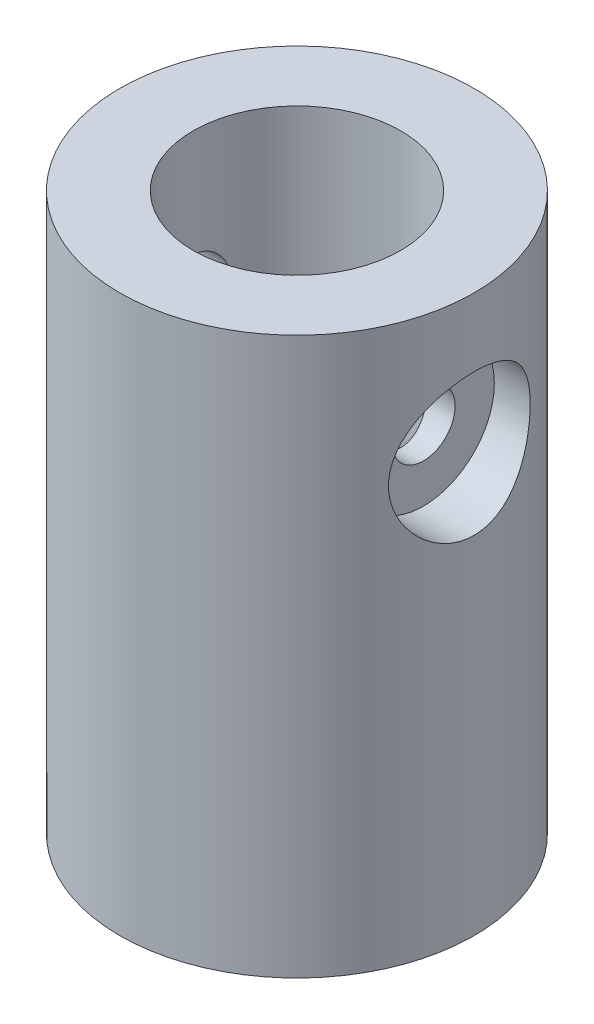
ISO-10303-21;
HEADER;
FILE_DESCRIPTION(('STEP AP214'),'2;1');
FILE_NAME('part.step','',(''),(''),'','','');
FILE_SCHEMA(('AUTOMOTIVE_DESIGN { 1 0 10303 214 1 1 1 1 }'));
ENDSEC;
DATA;
#1=APPLICATION_CONTEXT('core data for automotive mechanical design processes');
#2=APPLICATION_PROTOCOL_DEFINITION('international standard','automotive_design',2000,#1);
#3=PRODUCT_CONTEXT('',#1,'mechanical');
#4=PRODUCT('Part','Part','',(#3));
#5=PRODUCT_RELATED_PRODUCT_CATEGORY('part','',(#4));
#6=PRODUCT_DEFINITION_FORMATION('','',#4);
#7=PRODUCT_DEFINITION_CONTEXT('part definition',#1,'design');
#8=PRODUCT_DEFINITION('design','',#6,#7);
#9=PRODUCT_DEFINITION_SHAPE('','',#8);
#10=(LENGTH_UNIT() NAMED_UNIT(*) SI_UNIT(.MILLI.,.METRE.));
#11=(NAMED_UNIT(*) PLANE_ANGLE_UNIT() SI_UNIT($,.RADIAN.));
#12=(NAMED_UNIT(*) SI_UNIT($,.STERADIAN.) SOLID_ANGLE_UNIT());
#13=UNCERTAINTY_MEASURE_WITH_UNIT(LENGTH_MEASURE(1.E-05),#10,'distance_accuracy_value','');
#14=(GEOMETRIC_REPRESENTATION_CONTEXT(3) GLOBAL_UNCERTAINTY_ASSIGNED_CONTEXT((#13)) GLOBAL_UNIT_ASSIGNED_CONTEXT((#10,
#11,#12)) REPRESENTATION_CONTEXT('',''));
#15=CARTESIAN_POINT('',(0.,0.,0.));
#16=DIRECTION('',(0.,0.,1.));
#17=DIRECTION('',(1.,0.,0.));
#18=AXIS2_PLACEMENT_3D('',#15,#16,#17);
#19=CARTESIAN_POINT('',(0.,8.,0.));
#20=DIRECTION('',(0.,1.,0.));
#21=DIRECTION('',(0.,0.,1.));
#22=AXIS2_PLACEMENT_3D('',#19,#20,#21);
#23=PLANE('',#22);
#24=CARTESIAN_POINT('',(0.,8.,0.));
#25=DIRECTION('',(0.,1.,0.));
#26=DIRECTION('',(0.,0.,1.));
#27=AXIS2_PLACEMENT_3D('',#24,#25,#26);
#28=CIRCLE('',#27,4.1);
#29=CARTESIAN_POINT('',(0.,8.,4.1));
#30=VERTEX_POINT('',#29);
#31=EDGE_CURVE('E140',#30,#30,#28,.T.);
#32=ORIENTED_EDGE('',*,*,#31,.T.);
#33=EDGE_LOOP('',(#32));
#34=FACE_BOUND('',#33,.T.);
#35=DIRECTION('',(0.,0.,-1.));
#36=VECTOR('',#35,1.);
#37=CARTESIAN_POINT('',(1.95,8.,2.00935312974101));
#38=LINE('',#37,#36);
#39=CARTESIAN_POINT('',(1.95,8.,2.00935312974101));
#40=VERTEX_POINT('',#39);
#41=CARTESIAN_POINT('',(1.95,8.,-2.00935312974101));
#42=VERTEX_POINT('',#41);
#43=EDGE_CURVE('E96',#40,#42,#38,.T.);
#44=ORIENTED_EDGE('',*,*,#43,.F.);
#45=CARTESIAN_POINT('',(0.,8.,0.));
#46=DIRECTION('',(0.,-1.,0.));
#47=DIRECTION('',(0.,0.,-1.));
#48=AXIS2_PLACEMENT_3D('',#45,#46,#47);
#49=CIRCLE('',#48,2.8);
#50=CARTESIAN_POINT('',(-1.95,8.,2.00935312974101));
#51=VERTEX_POINT('',#50);
#52=EDGE_CURVE('E89',#40,#51,#49,.T.);
#53=ORIENTED_EDGE('',*,*,#52,.T.);
#54=DIRECTION('',(0.,0.,-1.));
#55=VECTOR('',#54,1.);
#56=CARTESIAN_POINT('',(-1.95,8.,2.00935312974101));
#57=LINE('',#56,#55);
#58=CARTESIAN_POINT('',(-1.95,8.,-2.00935312974101));
#59=VERTEX_POINT('',#58);
#60=EDGE_CURVE('E99',#51,#59,#57,.T.);
#61=ORIENTED_EDGE('',*,*,#60,.T.);
#62=CARTESIAN_POINT('',(0.,8.,0.));
#63=DIRECTION('',(0.,-1.,0.));
#64=DIRECTION('',(0.,0.,-1.));
#65=AXIS2_PLACEMENT_3D('',#62,#63,#64);
#66=CIRCLE('',#65,2.8);
#67=EDGE_CURVE('E60',#59,#42,#66,.T.);
#68=ORIENTED_EDGE('',*,*,#67,.T.);
#69=EDGE_LOOP('',(#44,#53,#61,#68));
#70=FACE_BOUND('',#69,.T.);
#71=ADVANCED_FACE('F39',(#34,#70),#23,.T.);
#72=CARTESIAN_POINT('',(0.,22.,0.));
#73=DIRECTION('',(0.,-1.,0.));
#74=DIRECTION('',(0.,0.,-1.));
#75=AXIS2_PLACEMENT_3D('',#72,#73,#74);
#76=CYLINDRICAL_SURFACE('',#75,7.);
#77=CARTESIAN_POINT('',(6.41560597293818,16.5,-2.79999999999999));
#78=CARTESIAN_POINT('',(6.41561231891632,16.3500268344019,-2.79999356095231));
#79=CARTESIAN_POINT('',(6.42093807315972,16.1998031879354,-2.78787842974769));
#80=CARTESIAN_POINT('',(6.4415551662924,15.9036852822606,-2.73989395224752));
#81=CARTESIAN_POINT('',(6.45687196879686,15.7578030839261,-2.70396390645276));
#82=CARTESIAN_POINT('',(6.49544575006911,15.4751274674408,-2.60992976266701));
#83=CARTESIAN_POINT('',(6.51867277965235,15.3383020593923,-2.55190920597971));
#84=CARTESIAN_POINT('',(6.57040548064423,15.0763605031928,-2.41558818471813));
#85=CARTESIAN_POINT('',(6.59890999908856,14.9512418064663,-2.33729214820789));
#86=CARTESIAN_POINT('',(6.6598120618727,14.7090355596379,-2.15785081992555));
#87=CARTESIAN_POINT('',(6.69233483831648,14.5927010408439,-2.05573111571171));
#88=CARTESIAN_POINT('',(6.75657441081389,14.3782593708019,-1.83359273318501));
#89=CARTESIAN_POINT('',(6.78829092188466,14.2801585892064,-1.71356782628285));
#90=CARTESIAN_POINT('',(6.84884770697953,14.1012310535664,-1.45320883872224));
#91=CARTESIAN_POINT('',(6.87752525057598,14.0212379804397,-1.31226055298673));
#92=CARTESIAN_POINT('',(6.92725498783522,13.8864190017567,-1.01755545089609));
#93=CARTESIAN_POINT('',(6.94831028364549,13.8315828552516,-0.863803876707634));
#94=CARTESIAN_POINT('',(6.97953654986852,13.7513219196097,-0.555752997855653));
#95=CARTESIAN_POINT('',(6.99018511478879,13.7246017604417,-0.401840578801641));
#96=CARTESIAN_POINT('',(7.00112434962403,13.697160119906,-0.0913728600175459));
#97=CARTESIAN_POINT('',(7.00141888278779,13.6964289416479,0.0651814321751764));
#98=CARTESIAN_POINT('',(6.99190747948857,13.7202758777259,0.367125492582925));
#99=CARTESIAN_POINT('',(6.98266795480079,13.7434346818566,0.51264843401864));
#100=CARTESIAN_POINT('',(6.95589008056798,13.8119900268242,0.797542352910679));
#101=CARTESIAN_POINT('',(6.93835112209878,13.8573881993579,0.936912878147734));
#102=CARTESIAN_POINT('',(6.89635554240454,13.9696910760296,1.20805711391478));
#103=CARTESIAN_POINT('',(6.87179864652713,14.0369096007415,1.33968467273045));
#104=CARTESIAN_POINT('',(6.81820419252385,14.1906510096868,1.59013141103784));
#105=CARTESIAN_POINT('',(6.78916509974009,14.2771805103402,1.70894617980514));
#106=CARTESIAN_POINT('',(6.72730292046572,14.4737087903214,1.93867635918624));
#107=CARTESIAN_POINT('',(6.69435657116462,14.5848754496019,2.04856098337284));
#108=CARTESIAN_POINT('',(6.62986325362568,14.8241868005648,2.24855038154971));
#109=CARTESIAN_POINT('',(6.59831674611307,14.9523370274738,2.33864868130177));
#110=CARTESIAN_POINT('',(6.53935656372632,15.2265866313235,2.49886586420698));
#111=CARTESIAN_POINT('',(6.51208479680791,15.3730907624741,2.56834851229076));
#112=CARTESIAN_POINT('',(6.46642626481718,15.6771016864371,2.68124676381304));
#113=CARTESIAN_POINT('',(6.44803373047835,15.8346012586172,2.72467929772917));
#114=CARTESIAN_POINT('',(6.42361663583803,16.1458500884544,2.78173692839685));
#115=CARTESIAN_POINT('',(6.41690513038593,16.29924062598,2.79702093554036));
#116=CARTESIAN_POINT('',(6.41465297016654,16.6065080908634,2.80218585702004));
#117=CARTESIAN_POINT('',(6.41910892784507,16.7603848565859,2.79207447482779));
#118=CARTESIAN_POINT('',(6.43798462102759,17.0550425089397,2.74824605270604));
#119=CARTESIAN_POINT('',(6.45182240917622,17.1960701123601,2.7159062868334));
#120=CARTESIAN_POINT('',(6.48718071438276,17.4706037666996,2.63032586167522));
#121=CARTESIAN_POINT('',(6.50870293484037,17.60410814235,2.57708056802318));
#122=CARTESIAN_POINT('',(6.55807294604142,17.8658433009139,2.4487898952742));
#123=CARTESIAN_POINT('',(6.58614186494848,17.9936406641724,2.3729480155705));
#124=CARTESIAN_POINT('',(6.64510539220913,18.2352761824182,2.20243131421855));
#125=CARTESIAN_POINT('',(6.67600114854463,18.3491086219136,2.10774882287465));
#126=CARTESIAN_POINT('',(6.73989282359983,18.5683227720391,1.89398189635281));
#127=CARTESIAN_POINT('',(6.77287530199327,18.6724591914082,1.77361160122361));
#128=CARTESIAN_POINT('',(6.83507712394545,18.8592479072537,1.51631708671591));
#129=CARTESIAN_POINT('',(6.8642963143039,18.9418993292332,1.37939219385325));
#130=CARTESIAN_POINT('',(6.91577202260546,19.0830666770487,1.09239190760422));
#131=CARTESIAN_POINT('',(6.93803020736924,19.1415883818431,0.942319673398243));
#132=CARTESIAN_POINT('',(6.97301798856466,19.2321683933597,0.633351027280367));
#133=CARTESIAN_POINT('',(6.98575275588545,19.264241061975,0.474459454387547));
#134=CARTESIAN_POINT('',(6.99970611496602,19.299306582314,0.163543114507662));
#135=CARTESIAN_POINT('',(7.00162185449643,19.3040601799868,0.0117466897129226));
#136=CARTESIAN_POINT('',(6.9956045932321,19.2890023288631,-0.290407370109171));
#137=CARTESIAN_POINT('',(6.98767308328284,19.2691945985822,-0.44076521946014));
#138=CARTESIAN_POINT('',(6.9632011873457,19.2068344968002,-0.731039262426754));
#139=CARTESIAN_POINT('',(6.94693272978597,19.1649994773408,-0.871134325410813));
#140=CARTESIAN_POINT('',(6.90752926874301,19.0605260717665,-1.14229129775964));
#141=CARTESIAN_POINT('',(6.88439299888003,18.9978838486853,-1.27335153566477));
#142=CARTESIAN_POINT('',(6.83225332456614,18.8504555293055,-1.52908425432721));
#143=CARTESIAN_POINT('',(6.8030358296208,18.7648132145448,-1.65321852526233));
#144=CARTESIAN_POINT('',(6.74225163117912,18.5750960457542,-1.8858756562071));
#145=CARTESIAN_POINT('',(6.71068395849954,18.4710135625485,-1.99439202087628));
#146=CARTESIAN_POINT('',(6.64632874314752,18.2397587944119,-2.19968170652229));
#147=CARTESIAN_POINT('',(6.61358666119334,18.1115559947983,-2.29531219403885));
#148=CARTESIAN_POINT('',(6.55269519591049,17.8398805899908,-2.46378667868409));
#149=CARTESIAN_POINT('',(6.52454635273628,17.696406192165,-2.53662799678074));
#150=CARTESIAN_POINT('',(6.47862479934689,17.4113493389417,-2.65158667832287));
#151=CARTESIAN_POINT('',(6.46014735352581,17.2707537562026,-2.69587549931374));
#152=CARTESIAN_POINT('',(6.43224156447768,16.9837153419103,-2.76180787299884));
#153=CARTESIAN_POINT('',(6.4227880120661,16.8372899972059,-2.7835145266825));
#154=CARTESIAN_POINT('',(6.41748469518927,16.6585104652439,-2.79569083059717));
#155=CARTESIAN_POINT('',(6.41678143564198,16.626837927501,-2.79730543052653));
#156=CARTESIAN_POINT('',(6.41584138611812,16.5634473324839,-2.7994607357395));
#157=CARTESIAN_POINT('',(6.41560463034288,16.5317292720428,-2.80000136228567));
#158=CARTESIAN_POINT('',(6.41560597293818,16.5,-2.79999999999999));
#159=B_SPLINE_CURVE_WITH_KNOTS('',3,(#77,#78,#79,#80,#81,#82,#83,#84,#85,#86,#87,#88,#89,#90,
#91,#92,#93,#94,#95,#96,#97,#98,#99,#100,#101,#102,#103,#104,#105,#106,#107,#108,#109,#110,#111,
#112,#113,#114,#115,#116,#117,#118,#119,#120,#121,#122,#123,#124,#125,#126,#127,#128,#129,#130,
#131,#132,#133,#134,#135,#136,#137,#138,#139,#140,#141,#142,#143,#144,#145,#146,#147,#148,#149,
#150,#151,#152,#153,#154,#155,#156,#157,#158),.UNSPECIFIED.,.T.,.F.,(4,2,2,2,2,2,2,2,2,2,2,2,2,
2,2,2,2,2,2,2,2,2,2,2,2,2,2,2,2,2,2,2,2,2,2,2,2,2,2,2,4),(0.,0.449788708274711,
0.900728270151142,1.34997915261074,1.79913200353406,2.27157865598194,2.74419004087679,
3.23543736727999,3.72648453757272,4.19375856042056,4.6608582342794,5.10172102762422,
5.54261617180682,5.99015620328856,6.43784980916042,6.91493661713896,7.39217929977976,
7.88290242204159,8.3733062672014,8.83375006534187,9.29405420871113,9.72814147319201,
10.1623250211229,10.6141161651378,11.0660916033619,11.5514522794577,12.0368327079384,
12.5220968223793,13.0070972633579,13.4604545565833,13.9137432211764,14.3531079222069,
14.7925536896002,15.2514187159589,15.7104740318989,16.1979475459986,16.6854783446286,
17.129233251467,17.5717448230694,17.6668979929343,17.7620581386157),.UNSPECIFIED.);
#160=CARTESIAN_POINT('',(6.41560597293818,16.5,-2.79999999999999));
#161=VERTEX_POINT('',#160);
#162=EDGE_CURVE('E11',#161,#161,#159,.T.);
#163=ORIENTED_EDGE('',*,*,#162,.T.);
#164=EDGE_LOOP('',(#163));
#165=FACE_BOUND('',#164,.T.);
#166=CARTESIAN_POINT('',(-7.,15.25,0.));
#167=CARTESIAN_POINT('',(-6.99999876397597,15.2500027213011,-0.0696197924423471));
#168=CARTESIAN_POINT('',(-6.99895060928587,15.2558359512252,-0.139275699399385));
#169=CARTESIAN_POINT('',(-6.99487029587919,15.2790020831912,-0.276628730775726));
#170=CARTESIAN_POINT('',(-6.99183639636521,15.2963450754189,-0.344324082054934));
#171=CARTESIAN_POINT('',(-6.98412437753366,15.341986116619,-0.475749358001673));
#172=CARTESIAN_POINT('',(-6.97944768188137,15.3702746821842,-0.539482660117311));
#173=CARTESIAN_POINT('',(-6.96896231649392,15.4369778441085,-0.661291471994225));
#174=CARTESIAN_POINT('',(-6.96315375502504,15.4753914720997,-0.719367522091878));
#175=CARTESIAN_POINT('',(-6.95097616233974,15.5616996065088,-0.828853721624178));
#176=CARTESIAN_POINT('',(-6.94460221026335,15.6096830649355,-0.880193210153491));
#177=CARTESIAN_POINT('',(-6.93204924305886,15.7135773747688,-0.974138056636682));
#178=CARTESIAN_POINT('',(-6.92587024118302,15.7694887636844,-1.01674282190199));
#179=CARTESIAN_POINT('',(-6.91435905121301,15.8881450585567,-1.09229802264274));
#180=CARTESIAN_POINT('',(-6.90903321476433,15.950935843462,-1.1251774596852));
#181=CARTESIAN_POINT('',(-6.89990026216799,16.0812605793323,-1.17989439084462));
#182=CARTESIAN_POINT('',(-6.89609302772464,16.1487941603619,-1.20173274507262));
#183=CARTESIAN_POINT('',(-6.89047765557561,16.2859344107074,-1.23352263528583));
#184=CARTESIAN_POINT('',(-6.88864889795947,16.3555117775708,-1.24359686781956));
#185=CARTESIAN_POINT('',(-6.88713528511934,16.4953914610037,-1.25195320297837));
#186=CARTESIAN_POINT('',(-6.88745025566986,16.5656937181961,-1.25023626389775));
#187=CARTESIAN_POINT('',(-6.89016971388499,16.7041444487183,-1.23515868236774));
#188=CARTESIAN_POINT('',(-6.8925492980011,16.7723085951271,-1.22193680797516));
#189=CARTESIAN_POINT('',(-6.89909080824473,16.9054353182493,-1.18444287693055));
#190=CARTESIAN_POINT('',(-6.90325280368823,16.9703977703427,-1.16017039053015));
#191=CARTESIAN_POINT('',(-6.9129166031172,17.0956872394346,-1.1011263389819));
#192=CARTESIAN_POINT('',(-6.91842561521352,17.1559869408044,-1.0662980393802));
#193=CARTESIAN_POINT('',(-6.93015785316704,17.2699387511077,-0.987171201031503));
#194=CARTESIAN_POINT('',(-6.93638114494264,17.3235902455496,-0.942871787902346));
#195=CARTESIAN_POINT('',(-6.94894965501386,17.4235251088937,-0.845308544532937));
#196=CARTESIAN_POINT('',(-6.95529534624387,17.4696924589898,-0.791925855758308));
#197=CARTESIAN_POINT('',(-6.96731186800251,17.552433066454,-0.678111000701381));
#198=CARTESIAN_POINT('',(-6.97298269290384,17.5890062438252,-0.617678775645578));
#199=CARTESIAN_POINT('',(-6.98302041929516,17.6515345118481,-0.491364562705143));
#200=CARTESIAN_POINT('',(-6.98738593655032,17.6774783411489,-0.425476883346249));
#201=CARTESIAN_POINT('',(-6.99431030998523,17.717898441096,-0.290183700517968));
#202=CARTESIAN_POINT('',(-6.99686933998133,17.7323758150364,-0.220778536182409));
#203=CARTESIAN_POINT('',(-6.9998687531765,17.7492924230225,-0.0814194926908551));
#204=CARTESIAN_POINT('',(-7.00033713461244,17.751890754274,-0.0114855085287159));
#205=CARTESIAN_POINT('',(-6.99917952689596,17.7454011301183,0.127817981130509));
#206=CARTESIAN_POINT('',(-6.99755363071634,17.7363136934861,0.197187511548229));
#207=CARTESIAN_POINT('',(-6.99240754172808,17.7068428007548,0.332894154940018));
#208=CARTESIAN_POINT('',(-6.98890072530254,17.6865390803911,0.399249135096586));
#209=CARTESIAN_POINT('',(-6.98038436613849,17.6352976849073,0.52761333334735));
#210=CARTESIAN_POINT('',(-6.97537472895227,17.6043593414156,0.589622278004152));
#211=CARTESIAN_POINT('',(-6.96433866934137,17.5323693885438,0.708218549757097));
#212=CARTESIAN_POINT('',(-6.95830256688857,17.4912196042301,0.764745364265277));
#213=CARTESIAN_POINT('',(-6.94590984015708,17.4001086744692,0.870148314945128));
#214=CARTESIAN_POINT('',(-6.93955318894436,17.3501467877033,0.919023806795196));
#215=CARTESIAN_POINT('',(-6.92714394562996,17.2421125153762,1.00833474628658));
#216=CARTESIAN_POINT('',(-6.92109590760897,17.1839501495664,1.04866208560834));
#217=CARTESIAN_POINT('',(-6.91007733322136,17.0615831552756,1.11897413538699));
#218=CARTESIAN_POINT('',(-6.90510675924693,16.9973787377986,1.14895920685206));
#219=CARTESIAN_POINT('',(-6.89684095181923,16.8650369125797,1.19757853098714));
#220=CARTESIAN_POINT('',(-6.89353813880083,16.7969188945909,1.21626421462317));
#221=CARTESIAN_POINT('',(-6.88896372120458,16.6584463524269,1.24191447945726));
#222=CARTESIAN_POINT('',(-6.88769191101738,16.5880920553776,1.24888024712932));
#223=CARTESIAN_POINT('',(-6.88733324217078,16.4482253955493,1.25085614890263));
#224=CARTESIAN_POINT('',(-6.88821524963872,16.3787154614291,1.24603664017667));
#225=CARTESIAN_POINT('',(-6.89199615523606,16.241513090991,1.22494973121549));
#226=CARTESIAN_POINT('',(-6.89489504388228,16.173820646129,1.20868238480685));
#227=CARTESIAN_POINT('',(-6.90237052940211,16.0422550619833,1.16523056932674));
#228=CARTESIAN_POINT('',(-6.9069445462846,15.978376224107,1.13806288257357));
#229=CARTESIAN_POINT('',(-6.91725701322019,15.8560557802816,1.07359967028368));
#230=CARTESIAN_POINT('',(-6.92299553483587,15.7976145088108,1.03630352227252));
#231=CARTESIAN_POINT('',(-6.93508798882304,15.686971476305,0.952042837143912));
#232=CARTESIAN_POINT('',(-6.94144922951403,15.6348653841284,0.904953705777511));
#233=CARTESIAN_POINT('',(-6.95401412176594,15.5392370970169,0.802704998630157));
#234=CARTESIAN_POINT('',(-6.9602177367425,15.4957168792614,0.747543569019636));
#235=CARTESIAN_POINT('',(-6.9718267339403,15.4181711161056,0.630185373301316));
#236=CARTESIAN_POINT('',(-6.97722528421424,15.3842248703042,0.567935518835289));
#237=CARTESIAN_POINT('',(-6.98654935562556,15.3273253983536,0.438542420095239));
#238=CARTESIAN_POINT('',(-6.99047629672906,15.3043615692512,0.371403967978271));
#239=CARTESIAN_POINT('',(-6.99558898678742,15.274884693302,0.253365877745874));
#240=CARTESIAN_POINT('',(-6.99723399859316,15.2655684315316,0.203167433835835));
#241=CARTESIAN_POINT('',(-6.99943994626216,15.2531251547981,0.101985776019469));
#242=CARTESIAN_POINT('',(-7.00000090549557,15.2499980064093,0.0510025790548298));
#243=CARTESIAN_POINT('',(-7.,15.25,0.));
#244=B_SPLINE_CURVE_WITH_KNOTS('',3,(#166,#167,#168,#169,#170,#171,#172,#173,#174,#175,#176,
#177,#178,#179,#180,#181,#182,#183,#184,#185,#186,#187,#188,#189,#190,#191,#192,#193,#194,#195,
#196,#197,#198,#199,#200,#201,#202,#203,#204,#205,#206,#207,#208,#209,#210,#211,#212,#213,#214,
#215,#216,#217,#218,#219,#220,#221,#222,#223,#224,#225,#226,#227,#228,#229,#230,#231,#232,#233,
#234,#235,#236,#237,#238,#239,#240,#241,#242,#243),.UNSPECIFIED.,.T.,.F.,(4,2,2,2,2,2,2,2,2,2,2,
2,2,2,2,2,2,2,2,2,2,2,2,2,2,2,2,2,2,2,2,2,2,2,2,2,2,2,4),(0.,0.208672898370815,
0.417528974687012,0.626204498745021,0.834860072169512,1.04555398394513,1.2562621874814,
1.46847268234669,1.68066664326101,1.89062713379412,2.10057056058128,2.30801629213301,
2.51547009175177,2.72405928697551,2.93266774767275,3.14425188945737,3.3558377953907,
3.56764729168083,3.77943640533441,3.98838053310807,4.1973153853916,4.40478370072621,
4.61226505754755,4.82182420244065,5.03140098492947,5.24348810388942,5.45556781896716,
5.6666748074336,5.87776042304787,6.08581286176574,6.29386432224867,6.50159668543024,
6.70934181830653,6.91991234386762,7.13053130374626,7.34284672270062,7.55495674626048,
7.70783116702343,7.86070229206409),.UNSPECIFIED.);
#245=CARTESIAN_POINT('',(-7.,15.25,0.));
#246=VERTEX_POINT('',#245);
#247=EDGE_CURVE('E112',#246,#246,#244,.T.);
#248=ORIENTED_EDGE('',*,*,#247,.T.);
#249=EDGE_LOOP('',(#248));
#250=FACE_BOUND('',#249,.T.);
#251=CARTESIAN_POINT('',(0.,22.,0.));
#252=DIRECTION('',(0.,1.,0.));
#253=DIRECTION('',(0.,0.,1.));
#254=AXIS2_PLACEMENT_3D('',#251,#252,#253);
#255=CIRCLE('',#254,7.);
#256=CARTESIAN_POINT('',(0.,22.,7.));
#257=VERTEX_POINT('',#256);
#258=EDGE_CURVE('E53',#257,#257,#255,.T.);
#259=ORIENTED_EDGE('',*,*,#258,.F.);
#260=EDGE_LOOP('',(#259));
#261=FACE_BOUND('',#260,.T.);
#262=CARTESIAN_POINT('',(0.,0.,0.));
#263=DIRECTION('',(0.,1.,0.));
#264=DIRECTION('',(0.,0.,1.));
#265=AXIS2_PLACEMENT_3D('',#262,#263,#264);
#266=CIRCLE('',#265,7.);
#267=CARTESIAN_POINT('',(0.,0.,7.));
#268=VERTEX_POINT('',#267);
#269=EDGE_CURVE('E144',#268,#268,#266,.T.);
#270=ORIENTED_EDGE('',*,*,#269,.T.);
#271=EDGE_LOOP('',(#270));
#272=FACE_BOUND('',#271,.T.);
#273=ADVANCED_FACE('F41',(#165,#250,#261,#272),#76,.T.);
#274=CARTESIAN_POINT('',(0.,22.,0.));
#275=DIRECTION('',(0.,1.,0.));
#276=DIRECTION('',(0.,0.,1.));
#277=AXIS2_PLACEMENT_3D('',#274,#275,#276);
#278=PLANE('',#277);
#279=CARTESIAN_POINT('',(0.,22.,0.));
#280=DIRECTION('',(0.,1.,0.));
#281=DIRECTION('',(0.,0.,1.));
#282=AXIS2_PLACEMENT_3D('',#279,#280,#281);
#283=CIRCLE('',#282,4.1);
#284=CARTESIAN_POINT('',(0.,22.,4.1));
#285=VERTEX_POINT('',#284);
#286=EDGE_CURVE('E134',#285,#285,#283,.T.);
#287=ORIENTED_EDGE('',*,*,#286,.F.);
#288=EDGE_LOOP('',(#287));
#289=FACE_BOUND('',#288,.T.);
#290=ORIENTED_EDGE('',*,*,#258,.T.);
#291=EDGE_LOOP('',(#290));
#292=FACE_BOUND('',#291,.T.);
#293=ADVANCED_FACE('F196',(#289,#292),#278,.T.);
#294=CARTESIAN_POINT('',(0.,0.,0.));
#295=DIRECTION('',(0.,1.,0.));
#296=DIRECTION('',(0.,0.,1.));
#297=AXIS2_PLACEMENT_3D('',#294,#295,#296);
#298=PLANE('',#297);
#299=DIRECTION('',(0.,0.,-1.));
#300=VECTOR('',#299,1.);
#301=CARTESIAN_POINT('',(-1.95,0.,2.00935312974101));
#302=LINE('',#301,#300);
#303=CARTESIAN_POINT('',(-1.95,0.,2.00935312974101));
#304=VERTEX_POINT('',#303);
#305=CARTESIAN_POINT('',(-1.95,0.,-2.00935312974101));
#306=VERTEX_POINT('',#305);
#307=EDGE_CURVE('E125',#304,#306,#302,.T.);
#308=ORIENTED_EDGE('',*,*,#307,.F.);
#309=CARTESIAN_POINT('',(0.,0.,0.));
#310=DIRECTION('',(0.,-1.,0.));
#311=DIRECTION('',(0.,0.,-1.));
#312=AXIS2_PLACEMENT_3D('',#309,#310,#311);
#313=CIRCLE('',#312,2.8);
#314=CARTESIAN_POINT('',(1.95,0.,2.00935312974101));
#315=VERTEX_POINT('',#314);
#316=EDGE_CURVE('E68',#315,#304,#313,.T.);
#317=ORIENTED_EDGE('',*,*,#316,.F.);
#318=DIRECTION('',(0.,0.,-1.));
#319=VECTOR('',#318,1.);
#320=CARTESIAN_POINT('',(1.95,0.,2.00935312974101));
#321=LINE('',#320,#319);
#322=CARTESIAN_POINT('',(1.95,0.,-2.00935312974101));
#323=VERTEX_POINT('',#322);
#324=EDGE_CURVE('E105',#315,#323,#321,.T.);
#325=ORIENTED_EDGE('',*,*,#324,.T.);
#326=CARTESIAN_POINT('',(0.,0.,0.));
#327=DIRECTION('',(0.,-1.,0.));
#328=DIRECTION('',(0.,0.,-1.));
#329=AXIS2_PLACEMENT_3D('',#326,#327,#328);
#330=CIRCLE('',#329,2.8);
#331=EDGE_CURVE('E109',#306,#323,#330,.T.);
#332=ORIENTED_EDGE('',*,*,#331,.F.);
#333=EDGE_LOOP('',(#308,#317,#325,#332));
#334=FACE_BOUND('',#333,.T.);
#335=ORIENTED_EDGE('',*,*,#269,.F.);
#336=EDGE_LOOP('',(#335));
#337=FACE_BOUND('',#336,.T.);
#338=ADVANCED_FACE('F202',(#334,#337),#298,.F.);
#339=CARTESIAN_POINT('',(0.,8.,0.));
#340=DIRECTION('',(0.,1.,0.));
#341=DIRECTION('',(0.,0.,1.));
#342=AXIS2_PLACEMENT_3D('',#339,#340,#341);
#343=CYLINDRICAL_SURFACE('',#342,4.1);
#344=CARTESIAN_POINT('',(-3.90480473263389,16.5,-1.25));
#345=CARTESIAN_POINT('',(-3.90480533696911,16.4315616955219,-1.24999929300277));
#346=CARTESIAN_POINT('',(-3.90662366602327,16.3631163908961,-1.24436033543993));
#347=CARTESIAN_POINT('',(-3.91367027137718,16.2282306126243,-1.22201407455086));
#348=CARTESIAN_POINT('',(-3.9188996020272,16.1617907655169,-1.20530334888454));
#349=CARTESIAN_POINT('',(-3.93212207935396,16.0328885321719,-1.16143672462889));
#350=CARTESIAN_POINT('',(-3.9401105140755,15.9704195784803,-1.13429862491745));
#351=CARTESIAN_POINT('',(-3.95794466108407,15.8509050840716,-1.07040644598098));
#352=CARTESIAN_POINT('',(-3.96779067093122,15.7938604144614,-1.03365082578491));
#353=CARTESIAN_POINT('',(-3.98859154892873,15.6849490290637,-0.950280442581386));
#354=CARTESIAN_POINT('',(-3.99957062642586,15.6332857859162,-0.903405850785799));
#355=CARTESIAN_POINT('',(-4.02119408107037,15.5384181510766,-0.801684617841321));
#356=CARTESIAN_POINT('',(-4.03183841363051,15.495214882261,-0.746836920118021));
#357=CARTESIAN_POINT('',(-4.05186878855139,15.4176045018321,-0.629273257533816));
#358=CARTESIAN_POINT('',(-4.06122298965443,15.3834056566275,-0.566413903681806));
#359=CARTESIAN_POINT('',(-4.07733731077824,15.3261437849342,-0.435502380602121));
#360=CARTESIAN_POINT('',(-4.08409800951034,15.3030782738683,-0.367451373902125));
#361=CARTESIAN_POINT('',(-4.09409225744849,15.2694134954034,-0.230217649804602));
#362=CARTESIAN_POINT('',(-4.097423919348,15.2584667408316,-0.161127449259345));
#363=CARTESIAN_POINT('',(-4.10053060860348,15.24825059538,-0.0220160994852507));
#364=CARTESIAN_POINT('',(-4.1003064066707,15.2489786740534,0.0480048447234176));
#365=CARTESIAN_POINT('',(-4.09639558188231,15.2618600785735,0.184549214840143));
#366=CARTESIAN_POINT('',(-4.09282304604133,15.2736369544082,0.251111939825635));
#367=CARTESIAN_POINT('',(-4.08275626452868,15.3076656559347,0.381266852840577));
#368=CARTESIAN_POINT('',(-4.07626183158465,15.3299181530418,0.444858850179579));
#369=CARTESIAN_POINT('',(-4.0609250242017,15.3845162805012,0.568151861072284));
#370=CARTESIAN_POINT('',(-4.05205566825188,15.4169786965388,0.627797663505844));
#371=CARTESIAN_POINT('',(-4.03290736312669,15.4909822940143,0.740914426063178));
#372=CARTESIAN_POINT('',(-4.02262807111605,15.5325256850143,0.794383878523549));
#373=CARTESIAN_POINT('',(-4.00127532324526,15.6254568109889,0.895876054981172));
#374=CARTESIAN_POINT('',(-3.99018654146455,15.6771702651977,0.94359771570405));
#375=CARTESIAN_POINT('',(-3.96882011992022,15.7879724011646,1.02977831674832));
#376=CARTESIAN_POINT('',(-3.95854256644078,15.8470618657319,1.06823627265029));
#377=CARTESIAN_POINT('',(-3.93988743726619,15.9717536593837,1.13512563815181));
#378=CARTESIAN_POINT('',(-3.9315302870278,16.0374162126518,1.16345089672171));
#379=CARTESIAN_POINT('',(-3.91790343057054,16.1728941800316,1.20855043691834));
#380=CARTESIAN_POINT('',(-3.91263267816821,16.242708178096,1.22532863294334));
#381=CARTESIAN_POINT('',(-3.9060060141753,16.3816345440865,1.24628806849414));
#382=CARTESIAN_POINT('',(-3.90450755412035,16.4506709221365,1.25092826046613));
#383=CARTESIAN_POINT('',(-3.90520034116847,16.5885389021134,1.24876423864389));
#384=CARTESIAN_POINT('',(-3.90739105137104,16.6573705323776,1.24196169016005));
#385=CARTESIAN_POINT('',(-3.91507511195293,16.7909371987489,1.21751457844765));
#386=CARTESIAN_POINT('',(-3.92047736058715,16.8557327009909,1.20016880122644));
#387=CARTESIAN_POINT('',(-3.93388058880561,16.9814881738456,1.15547574057468));
#388=CARTESIAN_POINT('',(-3.94188197847787,17.0424475373859,1.12812687878875));
#389=CARTESIAN_POINT('',(-3.95985589686645,17.1606585405062,1.06334275326528));
#390=CARTESIAN_POINT('',(-3.96987666885009,17.2177617110487,1.02565030274855));
#391=CARTESIAN_POINT('',(-3.99065809043406,17.3249999867424,0.941552367259566));
#392=CARTESIAN_POINT('',(-4.00141892255698,17.3751333636405,0.895144727922541));
#393=CARTESIAN_POINT('',(-4.02297794392653,17.4690326906288,0.792770718403271));
#394=CARTESIAN_POINT('',(-4.03376109449005,17.5124724151323,0.736501196227478));
#395=CARTESIAN_POINT('',(-4.05372668174565,17.5893026750653,0.617212758182474));
#396=CARTESIAN_POINT('',(-4.06290919581376,17.6226936963137,0.554194168806291));
#397=CARTESIAN_POINT('',(-4.07858407610976,17.6781567317444,0.423603162118761));
#398=CARTESIAN_POINT('',(-4.08509626874588,17.7003124672912,0.356068803067205));
#399=CARTESIAN_POINT('',(-4.0947842054313,17.7328839014604,0.218000385380443));
#400=CARTESIAN_POINT('',(-4.09796093839393,17.7433030798614,0.147467222301999));
#401=CARTESIAN_POINT('',(-4.10055776169353,17.7518339951053,0.00841354277794184));
#402=CARTESIAN_POINT('',(-4.10012203594135,17.7504180862142,-0.0600756558579928));
#403=CARTESIAN_POINT('',(-4.09588486371618,17.7364532613114,-0.19579716592402));
#404=CARTESIAN_POINT('',(-4.09208361893878,17.7239050124608,-0.263029552428325));
#405=CARTESIAN_POINT('',(-4.08158538766655,17.6883273839382,-0.393579482570543));
#406=CARTESIAN_POINT('',(-4.07492192522999,17.665419187053,-0.456932932742952));
#407=CARTESIAN_POINT('',(-4.0593874872589,17.6098807089214,-0.578929212554862));
#408=CARTESIAN_POINT('',(-4.05051614251426,17.5772488014606,-0.637571252163359));
#409=CARTESIAN_POINT('',(-4.03113413057165,17.5019511242168,-0.75056867708717));
#410=CARTESIAN_POINT('',(-4.02057928598792,17.4589917105263,-0.804720741527783));
#411=CARTESIAN_POINT('',(-3.99915602199124,17.364783058461,-0.905204868867435));
#412=CARTESIAN_POINT('',(-3.98828751168707,17.3135313970083,-0.951534637902275));
#413=CARTESIAN_POINT('',(-3.96706850442476,17.2022825161289,-1.0365077914507));
#414=CARTESIAN_POINT('',(-3.95674460235879,17.1420630088124,-1.07486756181123));
#415=CARTESIAN_POINT('',(-3.93822075810486,17.0157271456071,-1.14087654853248));
#416=CARTESIAN_POINT('',(-3.93001985723495,16.9496134695396,-1.16853060207004));
#417=CARTESIAN_POINT('',(-3.91742815972479,16.8201172459335,-1.21003295441004));
#418=CARTESIAN_POINT('',(-3.91274020473212,16.757113886894,-1.22497826228117));
#419=CARTESIAN_POINT('',(-3.90642853848767,16.6294088563435,-1.24496104259796));
#420=CARTESIAN_POINT('',(-3.90480416124252,16.5647075570505,-1.25000066845699));
#421=CARTESIAN_POINT('',(-3.90480473263389,16.5,-1.25));
#422=B_SPLINE_CURVE_WITH_KNOTS('',3,(#344,#345,#346,#347,#348,#349,#350,#351,#352,#353,#354,
#355,#356,#357,#358,#359,#360,#361,#362,#363,#364,#365,#366,#367,#368,#369,#370,#371,#372,#373,
#374,#375,#376,#377,#378,#379,#380,#381,#382,#383,#384,#385,#386,#387,#388,#389,#390,#391,#392,
#393,#394,#395,#396,#397,#398,#399,#400,#401,#402,#403,#404,#405,#406,#407,#408,#409,#410,#411,
#412,#413,#414,#415,#416,#417,#418,#419,#420,#421),.UNSPECIFIED.,.T.,.F.,(4,2,2,2,2,2,2,2,2,2,2,
2,2,2,2,2,2,2,2,2,2,2,2,2,2,2,2,2,2,2,2,2,2,2,2,2,2,2,4),(0.,0.20507609012477,0.410215599909138,
0.615006493831042,0.819830220569309,1.03072211440607,1.24164198058497,1.45708035159844,
1.67247062192272,1.88151064672339,2.09050536402501,2.29262832112328,2.49476423467869,
2.69930194251023,2.90388947349788,3.11661085119789,3.32935482404433,3.54426640604674,
3.75910509813061,3.9656945586872,4.17225395600754,4.37321611789213,4.57421000265543,
4.78074277441397,4.98732666772835,5.20200033289722,5.41666361769502,5.62970289497797,
5.84267899148589,6.04719677573243,6.25170230405546,6.45387519443878,6.65608191565158,
6.86491179497573,7.07380280706021,7.28918552552742,7.50447081346478,7.69840984558486,
7.89230671229772),.UNSPECIFIED.);
#423=CARTESIAN_POINT('',(-3.90480473263389,16.5,-1.25));
#424=VERTEX_POINT('',#423);
#425=EDGE_CURVE('E161',#424,#424,#422,.T.);
#426=ORIENTED_EDGE('',*,*,#425,.T.);
#427=EDGE_LOOP('',(#426));
#428=FACE_BOUND('',#427,.T.);
#429=CARTESIAN_POINT('',(3.90480473263389,16.5,-1.25));
#430=CARTESIAN_POINT('',(3.90480533696911,16.5684383044781,-1.24999929300277));
#431=CARTESIAN_POINT('',(3.90662366602327,16.6368836091039,-1.24436033543993));
#432=CARTESIAN_POINT('',(3.91367027137718,16.7717693873757,-1.22201407455086));
#433=CARTESIAN_POINT('',(3.91889960202721,16.8382092344831,-1.20530334888454));
#434=CARTESIAN_POINT('',(3.93212207935396,16.9671114678281,-1.16143672462889));
#435=CARTESIAN_POINT('',(3.9401105140755,17.0295804215197,-1.13429862491745));
#436=CARTESIAN_POINT('',(3.95794466108407,17.1490949159284,-1.07040644598098));
#437=CARTESIAN_POINT('',(3.96779067093122,17.2061395855386,-1.03365082578491));
#438=CARTESIAN_POINT('',(3.98859154892873,17.3150509709363,-0.950280442581384));
#439=CARTESIAN_POINT('',(3.99957062642586,17.3667142140838,-0.903405850785798));
#440=CARTESIAN_POINT('',(4.02119408107037,17.4615818489234,-0.801684617841319));
#441=CARTESIAN_POINT('',(4.03183841363051,17.504785117739,-0.746836920118019));
#442=CARTESIAN_POINT('',(4.05186878855139,17.5823954981679,-0.629273257533815));
#443=CARTESIAN_POINT('',(4.06122298965443,17.6165943433725,-0.566413903681806));
#444=CARTESIAN_POINT('',(4.07733731077824,17.6738562150658,-0.435502380602122));
#445=CARTESIAN_POINT('',(4.08409800951034,17.6969217261317,-0.367451373902126));
#446=CARTESIAN_POINT('',(4.09409225744849,17.7305865045966,-0.230217649804603));
#447=CARTESIAN_POINT('',(4.097423919348,17.7415332591684,-0.161127449259345));
#448=CARTESIAN_POINT('',(4.10053060860348,17.75174940462,-0.0220160994852493));
#449=CARTESIAN_POINT('',(4.1003064066707,17.7510213259466,0.0480048447234192));
#450=CARTESIAN_POINT('',(4.09639558188231,17.7381399214265,0.184549214840145));
#451=CARTESIAN_POINT('',(4.09282304604133,17.7263630455918,0.251111939825637));
#452=CARTESIAN_POINT('',(4.08275626452868,17.6923343440653,0.38126685284058));
#453=CARTESIAN_POINT('',(4.07626183158465,17.6700818469582,0.444858850179581));
#454=CARTESIAN_POINT('',(4.0609250242017,17.6154837194988,0.568151861072286));
#455=CARTESIAN_POINT('',(4.05205566825188,17.5830213034612,0.627797663505846));
#456=CARTESIAN_POINT('',(4.03290736312669,17.5090177059857,0.74091442606318));
#457=CARTESIAN_POINT('',(4.02262807111605,17.4674743149857,0.794383878523552));
#458=CARTESIAN_POINT('',(4.00127532324526,17.3745431890111,0.895876054981175));
#459=CARTESIAN_POINT('',(3.99018654146455,17.3228297348023,0.943597715704052));
#460=CARTESIAN_POINT('',(3.96882011992022,17.2120275988354,1.02977831674832));
#461=CARTESIAN_POINT('',(3.95854256644078,17.1529381342681,1.06823627265029));
#462=CARTESIAN_POINT('',(3.93988743726619,17.0282463406163,1.13512563815181));
#463=CARTESIAN_POINT('',(3.9315302870278,16.9625837873482,1.16345089672171));
#464=CARTESIAN_POINT('',(3.91790343057054,16.8271058199684,1.20855043691834));
#465=CARTESIAN_POINT('',(3.91263267816821,16.757291821904,1.22532863294334));
#466=CARTESIAN_POINT('',(3.9060060141753,16.6183654559135,1.24628806849414));
#467=CARTESIAN_POINT('',(3.90450755412035,16.5493290778635,1.25092826046614));
#468=CARTESIAN_POINT('',(3.90520034116847,16.4114610978866,1.2487642386439));
#469=CARTESIAN_POINT('',(3.90739105137104,16.3426294676224,1.24196169016005));
#470=CARTESIAN_POINT('',(3.91507511195293,16.2090628012511,1.21751457844765));
#471=CARTESIAN_POINT('',(3.92047736058715,16.1442672990091,1.20016880122644));
#472=CARTESIAN_POINT('',(3.93388058880561,16.0185118261544,1.15547574057468));
#473=CARTESIAN_POINT('',(3.94188197847787,15.9575524626141,1.12812687878876));
#474=CARTESIAN_POINT('',(3.95985589686645,15.8393414594938,1.06334275326528));
#475=CARTESIAN_POINT('',(3.96987666885009,15.7822382889513,1.02565030274855));
#476=CARTESIAN_POINT('',(3.99065809043406,15.6750000132575,0.941552367259567));
#477=CARTESIAN_POINT('',(4.00141892255698,15.6248666363595,0.895144727922542));
#478=CARTESIAN_POINT('',(4.02297794392653,15.5309673093712,0.792770718403272));
#479=CARTESIAN_POINT('',(4.03376109449005,15.4875275848677,0.736501196227478));
#480=CARTESIAN_POINT('',(4.05372668174565,15.4106973249347,0.617212758182474));
#481=CARTESIAN_POINT('',(4.06290919581376,15.3773063036863,0.554194168806291));
#482=CARTESIAN_POINT('',(4.07858407610976,15.3218432682556,0.423603162118761));
#483=CARTESIAN_POINT('',(4.08509626874588,15.2996875327089,0.356068803067204));
#484=CARTESIAN_POINT('',(4.0947842054313,15.2671160985396,0.218000385380442));
#485=CARTESIAN_POINT('',(4.09796093839393,15.2566969201386,0.147467222301998));
#486=CARTESIAN_POINT('',(4.10055776169353,15.2481660048947,0.00841354277794108));
#487=CARTESIAN_POINT('',(4.10012203594135,15.2495819137858,-0.0600756558579933));
#488=CARTESIAN_POINT('',(4.09588486371618,15.2635467386886,-0.19579716592402));
#489=CARTESIAN_POINT('',(4.09208361893878,15.2760949875392,-0.263029552428326));
#490=CARTESIAN_POINT('',(4.08158538766655,15.3116726160618,-0.393579482570543));
#491=CARTESIAN_POINT('',(4.07492192522999,15.334580812947,-0.456932932742953));
#492=CARTESIAN_POINT('',(4.0593874872589,15.3901192910786,-0.578929212554862));
#493=CARTESIAN_POINT('',(4.05051614251426,15.4227511985394,-0.63757125216336));
#494=CARTESIAN_POINT('',(4.03113413057165,15.4980488757832,-0.750568677087171));
#495=CARTESIAN_POINT('',(4.02057928598791,15.5410082894737,-0.804720741527784));
#496=CARTESIAN_POINT('',(3.99915602199124,15.6352169415391,-0.905204868867436));
#497=CARTESIAN_POINT('',(3.98828751168707,15.6864686029917,-0.951534637902276));
#498=CARTESIAN_POINT('',(3.96706850442476,15.7977174838711,-1.0365077914507));
#499=CARTESIAN_POINT('',(3.95674460235879,15.8579369911876,-1.07486756181123));
#500=CARTESIAN_POINT('',(3.93822075810486,15.9842728543929,-1.14087654853248));
#501=CARTESIAN_POINT('',(3.93001985723495,16.0503865304605,-1.16853060207004));
#502=CARTESIAN_POINT('',(3.91742815972479,16.1798827540665,-1.21003295441004));
#503=CARTESIAN_POINT('',(3.91274020473212,16.242886113106,-1.22497826228116));
#504=CARTESIAN_POINT('',(3.90642853848767,16.3705911436565,-1.24496104259795));
#505=CARTESIAN_POINT('',(3.90480416124252,16.4352924429495,-1.25000066845699));
#506=CARTESIAN_POINT('',(3.90480473263389,16.5,-1.25));
#507=B_SPLINE_CURVE_WITH_KNOTS('',3,(#429,#430,#431,#432,#433,#434,#435,#436,#437,#438,#439,
#440,#441,#442,#443,#444,#445,#446,#447,#448,#449,#450,#451,#452,#453,#454,#455,#456,#457,#458,
#459,#460,#461,#462,#463,#464,#465,#466,#467,#468,#469,#470,#471,#472,#473,#474,#475,#476,#477,
#478,#479,#480,#481,#482,#483,#484,#485,#486,#487,#488,#489,#490,#491,#492,#493,#494,#495,#496,
#497,#498,#499,#500,#501,#502,#503,#504,#505,#506),.UNSPECIFIED.,.T.,.F.,(4,2,2,2,2,2,2,2,2,2,2,
2,2,2,2,2,2,2,2,2,2,2,2,2,2,2,2,2,2,2,2,2,2,2,2,2,2,2,4),(0.,0.20507609012477,0.410215599909138,
0.615006493831034,0.819830220569309,1.03072211440608,1.24164198058497,1.45708035159844,
1.67247062192272,1.88151064672339,2.09050536402502,2.29262832112328,2.49476423467869,
2.69930194251023,2.90388947349788,3.11661085119789,3.32935482404433,3.54426640604674,
3.75910509813061,3.9656945586872,4.17225395600755,4.37321611789213,4.57421000265543,
4.78074277441397,4.98732666772836,5.20200033289723,5.41666361769502,5.62970289497798,
5.84267899148589,6.04719677573244,6.25170230405546,6.45387519443878,6.65608191565159,
6.86491179497573,7.07380280706021,7.28918552552742,7.50447081346479,7.69840984558486,
7.89230671229772),.UNSPECIFIED.);
#508=CARTESIAN_POINT('',(3.90480473263389,16.5,-1.25));
#509=VERTEX_POINT('',#508);
#510=EDGE_CURVE('E154',#509,#509,#507,.T.);
#511=ORIENTED_EDGE('',*,*,#510,.T.);
#512=EDGE_LOOP('',(#511));
#513=FACE_BOUND('',#512,.T.);
#514=ORIENTED_EDGE('',*,*,#31,.F.);
#515=EDGE_LOOP('',(#514));
#516=FACE_BOUND('',#515,.T.);
#517=ORIENTED_EDGE('',*,*,#286,.T.);
#518=EDGE_LOOP('',(#517));
#519=FACE_BOUND('',#518,.T.);
#520=ADVANCED_FACE('F166',(#428,#513,#516,#519),#343,.F.);
#521=CARTESIAN_POINT('',(0.,8.,0.));
#522=DIRECTION('',(0.,-1.,0.));
#523=DIRECTION('',(0.,0.,-1.));
#524=AXIS2_PLACEMENT_3D('',#521,#522,#523);
#525=CYLINDRICAL_SURFACE('',#524,2.8);
#526=ORIENTED_EDGE('',*,*,#316,.T.);
#527=DIRECTION('',(0.,-1.,0.));
#528=VECTOR('',#527,1.);
#529=CARTESIAN_POINT('',(-1.95,8.,2.00935312974101));
#530=LINE('',#529,#528);
#531=EDGE_CURVE('E85',#51,#304,#530,.T.);
#532=ORIENTED_EDGE('',*,*,#531,.F.);
#533=ORIENTED_EDGE('',*,*,#52,.F.);
#534=DIRECTION('',(0.,-1.,0.));
#535=VECTOR('',#534,1.);
#536=CARTESIAN_POINT('',(1.95,8.,2.00935312974101));
#537=LINE('',#536,#535);
#538=EDGE_CURVE('E131',#40,#315,#537,.T.);
#539=ORIENTED_EDGE('',*,*,#538,.T.);
#540=EDGE_LOOP('',(#526,#532,#533,#539));
#541=FACE_BOUND('',#540,.T.);
#542=ADVANCED_FACE('F87',(#541),#525,.F.);
#543=CARTESIAN_POINT('',(1.95,8.,2.00935312974101));
#544=DIRECTION('',(-1.,0.,0.));
#545=DIRECTION('',(0.,0.,1.));
#546=AXIS2_PLACEMENT_3D('',#543,#544,#545);
#547=PLANE('',#546);
#548=ORIENTED_EDGE('',*,*,#324,.F.);
#549=ORIENTED_EDGE('',*,*,#538,.F.);
#550=ORIENTED_EDGE('',*,*,#43,.T.);
#551=DIRECTION('',(0.,-1.,0.));
#552=VECTOR('',#551,1.);
#553=CARTESIAN_POINT('',(1.95,8.,-2.00935312974101));
#554=LINE('',#553,#552);
#555=EDGE_CURVE('E135',#42,#323,#554,.T.);
#556=ORIENTED_EDGE('',*,*,#555,.T.);
#557=EDGE_LOOP('',(#548,#549,#550,#556));
#558=FACE_BOUND('',#557,.T.);
#559=ADVANCED_FACE('F178',(#558),#547,.T.);
#560=CARTESIAN_POINT('',(0.,8.,0.));
#561=DIRECTION('',(0.,-1.,0.));
#562=DIRECTION('',(0.,0.,-1.));
#563=AXIS2_PLACEMENT_3D('',#560,#561,#562);
#564=CYLINDRICAL_SURFACE('',#563,2.8);
#565=ORIENTED_EDGE('',*,*,#331,.T.);
#566=ORIENTED_EDGE('',*,*,#555,.F.);
#567=ORIENTED_EDGE('',*,*,#67,.F.);
#568=DIRECTION('',(0.,-1.,0.));
#569=VECTOR('',#568,1.);
#570=CARTESIAN_POINT('',(-1.95,8.,-2.00935312974101));
#571=LINE('',#570,#569);
#572=EDGE_CURVE('E95',#59,#306,#571,.T.);
#573=ORIENTED_EDGE('',*,*,#572,.T.);
#574=EDGE_LOOP('',(#565,#566,#567,#573));
#575=FACE_BOUND('',#574,.T.);
#576=ADVANCED_FACE('F183',(#575),#564,.F.);
#577=CARTESIAN_POINT('',(-1.95,8.,2.00935312974101));
#578=DIRECTION('',(-1.,0.,0.));
#579=DIRECTION('',(0.,0.,1.));
#580=AXIS2_PLACEMENT_3D('',#577,#578,#579);
#581=PLANE('',#580);
#582=ORIENTED_EDGE('',*,*,#307,.T.);
#583=ORIENTED_EDGE('',*,*,#572,.F.);
#584=ORIENTED_EDGE('',*,*,#60,.F.);
#585=ORIENTED_EDGE('',*,*,#531,.T.);
#586=EDGE_LOOP('',(#582,#583,#584,#585));
#587=FACE_BOUND('',#586,.T.);
#588=ADVANCED_FACE('F100',(#587),#581,.F.);
#589=CARTESIAN_POINT('',(7.,16.5,0.));
#590=DIRECTION('',(1.,0.,0.));
#591=DIRECTION('',(0.,0.,-1.));
#592=AXIS2_PLACEMENT_3D('',#589,#590,#591);
#593=CYLINDRICAL_SURFACE('',#592,2.8);
#594=CARTESIAN_POINT('',(5.,16.5,0.));
#595=DIRECTION('',(1.,0.,0.));
#596=DIRECTION('',(0.,0.,-1.));
#597=AXIS2_PLACEMENT_3D('',#594,#595,#596);
#598=CIRCLE('',#597,2.8);
#599=CARTESIAN_POINT('',(5.,16.5,-2.8));
#600=VERTEX_POINT('',#599);
#601=EDGE_CURVE('E305',#600,#600,#598,.T.);
#602=ORIENTED_EDGE('',*,*,#601,.F.);
#603=EDGE_LOOP('',(#602));
#604=FACE_BOUND('',#603,.T.);
#605=ORIENTED_EDGE('',*,*,#162,.F.);
#606=EDGE_LOOP('',(#605));
#607=FACE_BOUND('',#606,.T.);
#608=ADVANCED_FACE('F189',(#604,#607),#593,.F.);
#609=CARTESIAN_POINT('',(5.,17.75,0.));
#610=DIRECTION('',(-1.,0.,0.));
#611=DIRECTION('',(0.,0.,1.));
#612=AXIS2_PLACEMENT_3D('',#609,#610,#611);
#613=PLANE('',#612);
#614=CARTESIAN_POINT('',(5.,16.5,0.));
#615=DIRECTION('',(1.,0.,0.));
#616=DIRECTION('',(0.,0.,-1.));
#617=AXIS2_PLACEMENT_3D('',#614,#615,#616);
#618=CIRCLE('',#617,1.25);
#619=CARTESIAN_POINT('',(5.,16.5,-1.25));
#620=VERTEX_POINT('',#619);
#621=EDGE_CURVE('E162',#620,#620,#618,.T.);
#622=ORIENTED_EDGE('',*,*,#621,.F.);
#623=EDGE_LOOP('',(#622));
#624=FACE_BOUND('',#623,.T.);
#625=ORIENTED_EDGE('',*,*,#601,.T.);
#626=EDGE_LOOP('',(#625));
#627=FACE_BOUND('',#626,.T.);
#628=ADVANCED_FACE('F177',(#624,#627),#613,.F.);
#629=CARTESIAN_POINT('',(7.,16.5,0.));
#630=DIRECTION('',(1.,0.,0.));
#631=DIRECTION('',(0.,0.,-1.));
#632=AXIS2_PLACEMENT_3D('',#629,#630,#631);
#633=CYLINDRICAL_SURFACE('',#632,1.25);
#634=ORIENTED_EDGE('',*,*,#621,.T.);
#635=EDGE_LOOP('',(#634));
#636=FACE_BOUND('',#635,.T.);
#637=ORIENTED_EDGE('',*,*,#510,.F.);
#638=EDGE_LOOP('',(#637));
#639=FACE_BOUND('',#638,.T.);
#640=ADVANCED_FACE('F175',(#636,#639),#633,.F.);
#641=ORIENTED_EDGE('',*,*,#425,.F.);
#642=EDGE_LOOP('',(#641));
#643=FACE_BOUND('',#642,.T.);
#644=ORIENTED_EDGE('',*,*,#247,.F.);
#645=EDGE_LOOP('',(#644));
#646=FACE_BOUND('',#645,.T.);
#647=ADVANCED_FACE('F170',(#643,#646),#633,.F.);
#648=CLOSED_SHELL('',(#71,#273,#293,#338,#520,#542,#559,#576,#588,#608,#628,#640,#647));
#649=MANIFOLD_SOLID_BREP('B2',#648);
#650=ADVANCED_BREP_SHAPE_REPRESENTATION('',(#18,#649),#14);
#651=SHAPE_DEFINITION_REPRESENTATION(#9,#650);
ENDSEC;
END-ISO-10303-21;
